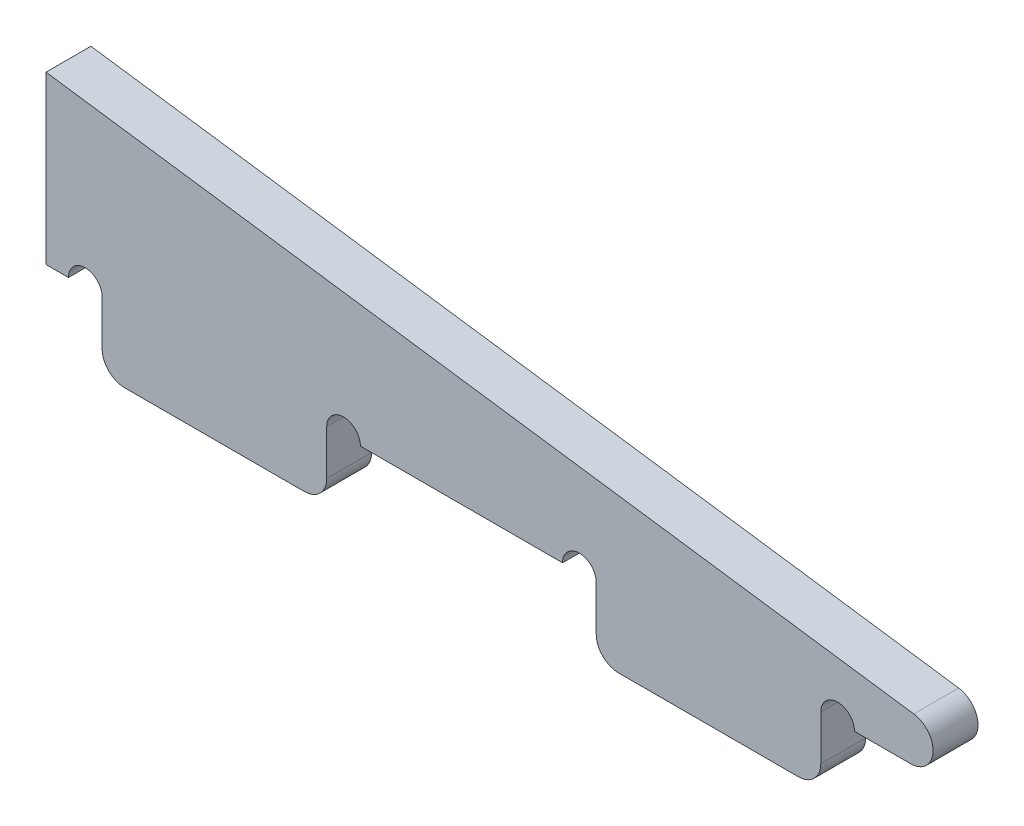
ISO-10303-21;
HEADER;
FILE_DESCRIPTION(('STEP AP214'),'2;1');
FILE_NAME('part.step','',(''),(''),'','','');
FILE_SCHEMA(('AUTOMOTIVE_DESIGN { 1 0 10303 214 1 1 1 1 }'));
ENDSEC;
DATA;
#1=APPLICATION_CONTEXT('core data for automotive mechanical design processes');
#2=APPLICATION_PROTOCOL_DEFINITION('international standard','automotive_design',2000,#1);
#3=PRODUCT_CONTEXT('',#1,'mechanical');
#4=PRODUCT('Part','Part','',(#3));
#5=PRODUCT_RELATED_PRODUCT_CATEGORY('part','',(#4));
#6=PRODUCT_DEFINITION_FORMATION('','',#4);
#7=PRODUCT_DEFINITION_CONTEXT('part definition',#1,'design');
#8=PRODUCT_DEFINITION('design','',#6,#7);
#9=PRODUCT_DEFINITION_SHAPE('','',#8);
#10=(LENGTH_UNIT() NAMED_UNIT(*) SI_UNIT(.MILLI.,.METRE.));
#11=(NAMED_UNIT(*) PLANE_ANGLE_UNIT() SI_UNIT($,.RADIAN.));
#12=(NAMED_UNIT(*) SI_UNIT($,.STERADIAN.) SOLID_ANGLE_UNIT());
#13=UNCERTAINTY_MEASURE_WITH_UNIT(LENGTH_MEASURE(1.E-05),#10,'distance_accuracy_value','');
#14=(GEOMETRIC_REPRESENTATION_CONTEXT(3) GLOBAL_UNCERTAINTY_ASSIGNED_CONTEXT((#13)) GLOBAL_UNIT_ASSIGNED_CONTEXT((#10,
#11,#12)) REPRESENTATION_CONTEXT('',''));
#15=CARTESIAN_POINT('',(0.,0.,0.));
#16=DIRECTION('',(0.,0.,1.));
#17=DIRECTION('',(1.,0.,0.));
#18=AXIS2_PLACEMENT_3D('',#15,#16,#17);
#19=CARTESIAN_POINT('',(0.,0.,2.));
#20=DIRECTION('',(0.,1.,0.));
#21=DIRECTION('',(0.,0.,1.));
#22=AXIS2_PLACEMENT_3D('',#19,#20,#21);
#23=PLANE('',#22);
#24=DIRECTION('',(1.,0.,0.));
#25=VECTOR('',#24,1.);
#26=CARTESIAN_POINT('',(0.,0.,2.));
#27=LINE('',#26,#25);
#28=CARTESIAN_POINT('',(1.5,0.,2.));
#29=VERTEX_POINT('',#28);
#30=CARTESIAN_POINT('',(4.,0.,2.));
#31=VERTEX_POINT('',#30);
#32=EDGE_CURVE('E202',#29,#31,#27,.T.);
#33=ORIENTED_EDGE('',*,*,#32,.F.);
#34=DIRECTION('',(0.,0.,1.));
#35=VECTOR('',#34,1.);
#36=CARTESIAN_POINT('',(1.5,0.,0.));
#37=LINE('',#36,#35);
#38=CARTESIAN_POINT('',(1.5,0.,0.));
#39=VERTEX_POINT('',#38);
#40=EDGE_CURVE('E187',#29,#39,#37,.F.);
#41=ORIENTED_EDGE('',*,*,#40,.T.);
#42=DIRECTION('',(1.,0.,0.));
#43=VECTOR('',#42,1.);
#44=CARTESIAN_POINT('',(0.,0.,0.));
#45=LINE('',#44,#43);
#46=CARTESIAN_POINT('',(4.,0.,0.));
#47=VERTEX_POINT('',#46);
#48=EDGE_CURVE('E200',#39,#47,#45,.T.);
#49=ORIENTED_EDGE('',*,*,#48,.T.);
#50=DIRECTION('',(0.,0.,-1.));
#51=VECTOR('',#50,1.);
#52=CARTESIAN_POINT('',(4.,0.,2.));
#53=LINE('',#52,#51);
#54=EDGE_CURVE('E265',#31,#47,#53,.T.);
#55=ORIENTED_EDGE('',*,*,#54,.F.);
#56=EDGE_LOOP('',(#33,#41,#49,#55));
#57=FACE_BOUND('',#56,.T.);
#58=ADVANCED_FACE('F44',(#57),#23,.F.);
#59=CARTESIAN_POINT('',(4.,1.,2.));
#60=DIRECTION('',(0.,0.,-1.));
#61=DIRECTION('',(-1.,0.,0.));
#62=AXIS2_PLACEMENT_3D('',#59,#60,#61);
#63=CYLINDRICAL_SURFACE('',#62,1.);
#64=CARTESIAN_POINT('',(4.,1.,0.));
#65=DIRECTION('',(0.,0.,1.));
#66=DIRECTION('',(1.,0.,0.));
#67=AXIS2_PLACEMENT_3D('',#64,#65,#66);
#68=CIRCLE('',#67,1.);
#69=CARTESIAN_POINT('',(4.13917310096006,1.99026806874157,0.));
#70=VERTEX_POINT('',#69);
#71=EDGE_CURVE('E208',#47,#70,#68,.T.);
#72=ORIENTED_EDGE('',*,*,#71,.T.);
#73=DIRECTION('',(0.,0.,-1.));
#74=VECTOR('',#73,1.);
#75=CARTESIAN_POINT('',(4.13917310096006,1.99026806874157,2.));
#76=LINE('',#75,#74);
#77=CARTESIAN_POINT('',(4.13917310096006,1.99026806874157,2.));
#78=VERTEX_POINT('',#77);
#79=EDGE_CURVE('E262',#78,#70,#76,.T.);
#80=ORIENTED_EDGE('',*,*,#79,.F.);
#81=CARTESIAN_POINT('',(4.,1.,2.));
#82=DIRECTION('',(0.,0.,1.));
#83=DIRECTION('',(1.,0.,0.));
#84=AXIS2_PLACEMENT_3D('',#81,#82,#83);
#85=CIRCLE('',#84,1.);
#86=EDGE_CURVE('E384',#31,#78,#85,.T.);
#87=ORIENTED_EDGE('',*,*,#86,.F.);
#88=ORIENTED_EDGE('',*,*,#54,.T.);
#89=EDGE_LOOP('',(#72,#80,#87,#88));
#90=FACE_BOUND('',#89,.T.);
#91=ADVANCED_FACE('F422',(#90),#63,.T.);
#92=CARTESIAN_POINT('',(4.13917310096006,1.99026806874157,2.));
#93=DIRECTION('',(-0.139173100960058,-0.990268068741571,0.));
#94=DIRECTION('',(0.990268068741571,-0.139173100960058,0.));
#95=AXIS2_PLACEMENT_3D('',#92,#93,#94);
#96=PLANE('',#95);
#97=DIRECTION('',(-0.990268068741571,0.139173100960058,0.));
#98=VECTOR('',#97,1.);
#99=CARTESIAN_POINT('',(4.13917310096006,1.99026806874157,0.));
#100=LINE('',#99,#98);
#101=CARTESIAN_POINT('',(-34.5,7.42064970856041,0.));
#102=VERTEX_POINT('',#101);
#103=EDGE_CURVE('E212',#70,#102,#100,.T.);
#104=ORIENTED_EDGE('',*,*,#103,.T.);
#105=DIRECTION('',(0.,0.,-1.));
#106=VECTOR('',#105,1.);
#107=CARTESIAN_POINT('',(-34.5,7.42064970856041,2.));
#108=LINE('',#107,#106);
#109=CARTESIAN_POINT('',(-34.5,7.42064970856041,2.));
#110=VERTEX_POINT('',#109);
#111=EDGE_CURVE('E259',#110,#102,#108,.T.);
#112=ORIENTED_EDGE('',*,*,#111,.F.);
#113=DIRECTION('',(-0.990268068741571,0.139173100960058,0.));
#114=VECTOR('',#113,1.);
#115=CARTESIAN_POINT('',(4.13917310096006,1.99026806874157,2.));
#116=LINE('',#115,#114);
#117=EDGE_CURVE('E393',#78,#110,#116,.T.);
#118=ORIENTED_EDGE('',*,*,#117,.F.);
#119=ORIENTED_EDGE('',*,*,#79,.T.);
#120=EDGE_LOOP('',(#104,#112,#118,#119));
#121=FACE_BOUND('',#120,.T.);
#122=ADVANCED_FACE('F417',(#121),#96,.F.);
#123=CARTESIAN_POINT('',(-34.5,7.42064970856041,2.));
#124=DIRECTION('',(1.,0.,0.));
#125=DIRECTION('',(0.,0.,-1.));
#126=AXIS2_PLACEMENT_3D('',#123,#124,#125);
#127=PLANE('',#126);
#128=DIRECTION('',(0.,-1.,0.));
#129=VECTOR('',#128,1.);
#130=CARTESIAN_POINT('',(-34.5,7.42064970856041,0.));
#131=LINE('',#130,#129);
#132=CARTESIAN_POINT('',(-34.5,0.,0.));
#133=VERTEX_POINT('',#132);
#134=EDGE_CURVE('E223',#102,#133,#131,.T.);
#135=ORIENTED_EDGE('',*,*,#134,.T.);
#136=DIRECTION('',(0.,0.,-1.));
#137=VECTOR('',#136,1.);
#138=CARTESIAN_POINT('',(-34.5,0.,2.));
#139=LINE('',#138,#137);
#140=CARTESIAN_POINT('',(-34.5,0.,2.));
#141=VERTEX_POINT('',#140);
#142=EDGE_CURVE('E256',#141,#133,#139,.T.);
#143=ORIENTED_EDGE('',*,*,#142,.F.);
#144=DIRECTION('',(0.,-1.,0.));
#145=VECTOR('',#144,1.);
#146=CARTESIAN_POINT('',(-34.5,7.42064970856041,2.));
#147=LINE('',#146,#145);
#148=EDGE_CURVE('E395',#110,#141,#147,.T.);
#149=ORIENTED_EDGE('',*,*,#148,.F.);
#150=ORIENTED_EDGE('',*,*,#111,.T.);
#151=EDGE_LOOP('',(#135,#143,#149,#150));
#152=FACE_BOUND('',#151,.T.);
#153=ADVANCED_FACE('F414',(#152),#127,.F.);
#154=CARTESIAN_POINT('',(-34.5,0.,2.));
#155=DIRECTION('',(0.,1.,0.));
#156=DIRECTION('',(0.,0.,1.));
#157=AXIS2_PLACEMENT_3D('',#154,#155,#156);
#158=PLANE('',#157);
#159=DIRECTION('',(1.,0.,0.));
#160=VECTOR('',#159,1.);
#161=CARTESIAN_POINT('',(-34.5,0.,0.));
#162=LINE('',#161,#160);
#163=CARTESIAN_POINT('',(-33.5,0.,0.));
#164=VERTEX_POINT('',#163);
#165=EDGE_CURVE('E225',#133,#164,#162,.T.);
#166=ORIENTED_EDGE('',*,*,#165,.T.);
#167=DIRECTION('',(0.,0.,1.));
#168=VECTOR('',#167,1.);
#169=CARTESIAN_POINT('',(-33.5,0.,0.));
#170=LINE('',#169,#168);
#171=CARTESIAN_POINT('',(-33.5,0.,2.));
#172=VERTEX_POINT('',#171);
#173=EDGE_CURVE('E210',#164,#172,#170,.T.);
#174=ORIENTED_EDGE('',*,*,#173,.T.);
#175=DIRECTION('',(1.,0.,0.));
#176=VECTOR('',#175,1.);
#177=CARTESIAN_POINT('',(-34.5,0.,2.));
#178=LINE('',#177,#176);
#179=EDGE_CURVE('E397',#141,#172,#178,.T.);
#180=ORIENTED_EDGE('',*,*,#179,.F.);
#181=ORIENTED_EDGE('',*,*,#142,.T.);
#182=EDGE_LOOP('',(#166,#174,#180,#181));
#183=FACE_BOUND('',#182,.T.);
#184=ADVANCED_FACE('F409',(#183),#158,.F.);
#185=CARTESIAN_POINT('',(-32.,0.,2.));
#186=DIRECTION('',(1.,0.,0.));
#187=DIRECTION('',(0.,0.,-1.));
#188=AXIS2_PLACEMENT_3D('',#185,#186,#187);
#189=PLANE('',#188);
#190=DIRECTION('',(0.,-1.,0.));
#191=VECTOR('',#190,1.);
#192=CARTESIAN_POINT('',(-32.,0.,0.));
#193=LINE('',#192,#191);
#194=CARTESIAN_POINT('',(-32.,0.,0.));
#195=VERTEX_POINT('',#194);
#196=CARTESIAN_POINT('',(-32.,-2.,0.));
#197=VERTEX_POINT('',#196);
#198=EDGE_CURVE('E228',#195,#197,#193,.T.);
#199=ORIENTED_EDGE('',*,*,#198,.T.);
#200=DIRECTION('',(0.,0.,-1.));
#201=VECTOR('',#200,1.);
#202=CARTESIAN_POINT('',(-32.,-2.,2.));
#203=LINE('',#202,#201);
#204=CARTESIAN_POINT('',(-32.,-2.,2.));
#205=VERTEX_POINT('',#204);
#206=EDGE_CURVE('E12',#197,#205,#203,.F.);
#207=ORIENTED_EDGE('',*,*,#206,.T.);
#208=DIRECTION('',(0.,-1.,0.));
#209=VECTOR('',#208,1.);
#210=CARTESIAN_POINT('',(-32.,0.,2.));
#211=LINE('',#210,#209);
#212=CARTESIAN_POINT('',(-32.,0.,2.));
#213=VERTEX_POINT('',#212);
#214=EDGE_CURVE('E299',#213,#205,#211,.T.);
#215=ORIENTED_EDGE('',*,*,#214,.F.);
#216=DIRECTION('',(0.,0.,-1.));
#217=VECTOR('',#216,1.);
#218=CARTESIAN_POINT('',(-32.,0.,2.));
#219=LINE('',#218,#217);
#220=EDGE_CURVE('E253',#213,#195,#219,.T.);
#221=ORIENTED_EDGE('',*,*,#220,.T.);
#222=EDGE_LOOP('',(#199,#207,#215,#221));
#223=FACE_BOUND('',#222,.T.);
#224=ADVANCED_FACE('F454',(#223),#189,.F.);
#225=CARTESIAN_POINT('',(-32.,-3.,2.));
#226=DIRECTION('',(0.,1.,0.));
#227=DIRECTION('',(0.,0.,1.));
#228=AXIS2_PLACEMENT_3D('',#225,#226,#227);
#229=PLANE('',#228);
#230=DIRECTION('',(1.,0.,0.));
#231=VECTOR('',#230,1.);
#232=CARTESIAN_POINT('',(-32.,-3.,0.));
#233=LINE('',#232,#231);
#234=CARTESIAN_POINT('',(-31.,-3.,0.));
#235=VERTEX_POINT('',#234);
#236=CARTESIAN_POINT('',(-23.,-3.,0.));
#237=VERTEX_POINT('',#236);
#238=EDGE_CURVE('E231',#235,#237,#233,.T.);
#239=ORIENTED_EDGE('',*,*,#238,.T.);
#240=DIRECTION('',(0.,0.,-1.));
#241=VECTOR('',#240,1.);
#242=CARTESIAN_POINT('',(-23.,-3.,2.));
#243=LINE('',#242,#241);
#244=CARTESIAN_POINT('',(-23.,-3.,2.));
#245=VERTEX_POINT('',#244);
#246=EDGE_CURVE('E52',#237,#245,#243,.F.);
#247=ORIENTED_EDGE('',*,*,#246,.T.);
#248=DIRECTION('',(1.,0.,0.));
#249=VECTOR('',#248,1.);
#250=CARTESIAN_POINT('',(-32.,-3.,2.));
#251=LINE('',#250,#249);
#252=CARTESIAN_POINT('',(-31.,-3.,2.));
#253=VERTEX_POINT('',#252);
#254=EDGE_CURVE('E295',#253,#245,#251,.T.);
#255=ORIENTED_EDGE('',*,*,#254,.F.);
#256=DIRECTION('',(0.,0.,-1.));
#257=VECTOR('',#256,1.);
#258=CARTESIAN_POINT('',(-31.,-3.,2.));
#259=LINE('',#258,#257);
#260=EDGE_CURVE('E342',#253,#235,#259,.T.);
#261=ORIENTED_EDGE('',*,*,#260,.T.);
#262=EDGE_LOOP('',(#239,#247,#255,#261));
#263=FACE_BOUND('',#262,.T.);
#264=ADVANCED_FACE('F347',(#263),#229,.F.);
#265=CARTESIAN_POINT('',(-22.,-3.,2.));
#266=DIRECTION('',(-1.,0.,0.));
#267=DIRECTION('',(0.,0.,1.));
#268=AXIS2_PLACEMENT_3D('',#265,#266,#267);
#269=PLANE('',#268);
#270=DIRECTION('',(0.,1.,0.));
#271=VECTOR('',#270,1.);
#272=CARTESIAN_POINT('',(-22.,-3.,2.));
#273=LINE('',#272,#271);
#274=CARTESIAN_POINT('',(-22.,-2.,2.));
#275=VERTEX_POINT('',#274);
#276=CARTESIAN_POINT('',(-22.,0.,2.));
#277=VERTEX_POINT('',#276);
#278=EDGE_CURVE('E298',#275,#277,#273,.T.);
#279=ORIENTED_EDGE('',*,*,#278,.F.);
#280=DIRECTION('',(0.,0.,-1.));
#281=VECTOR('',#280,1.);
#282=CARTESIAN_POINT('',(-22.,-2.,2.));
#283=LINE('',#282,#281);
#284=CARTESIAN_POINT('',(-22.,-2.,0.));
#285=VERTEX_POINT('',#284);
#286=EDGE_CURVE('E339',#275,#285,#283,.T.);
#287=ORIENTED_EDGE('',*,*,#286,.T.);
#288=DIRECTION('',(0.,1.,0.));
#289=VECTOR('',#288,1.);
#290=CARTESIAN_POINT('',(-22.,-3.,0.));
#291=LINE('',#290,#289);
#292=CARTESIAN_POINT('',(-22.,0.,0.));
#293=VERTEX_POINT('',#292);
#294=EDGE_CURVE('E234',#285,#293,#291,.T.);
#295=ORIENTED_EDGE('',*,*,#294,.T.);
#296=DIRECTION('',(0.,0.,-1.));
#297=VECTOR('',#296,1.);
#298=CARTESIAN_POINT('',(-22.,0.,2.));
#299=LINE('',#298,#297);
#300=EDGE_CURVE('E250',#277,#293,#299,.T.);
#301=ORIENTED_EDGE('',*,*,#300,.F.);
#302=EDGE_LOOP('',(#279,#287,#295,#301));
#303=FACE_BOUND('',#302,.T.);
#304=ADVANCED_FACE('F460',(#303),#269,.F.);
#305=CARTESIAN_POINT('',(-22.,0.,2.));
#306=DIRECTION('',(0.,1.,0.));
#307=DIRECTION('',(0.,0.,1.));
#308=AXIS2_PLACEMENT_3D('',#305,#306,#307);
#309=PLANE('',#308);
#310=DIRECTION('',(1.,0.,0.));
#311=VECTOR('',#310,1.);
#312=CARTESIAN_POINT('',(-22.,0.,2.));
#313=LINE('',#312,#311);
#314=CARTESIAN_POINT('',(-20.5,0.,2.));
#315=VERTEX_POINT('',#314);
#316=CARTESIAN_POINT('',(-11.5,0.,2.));
#317=VERTEX_POINT('',#316);
#318=EDGE_CURVE('E304',#315,#317,#313,.T.);
#319=ORIENTED_EDGE('',*,*,#318,.F.);
#320=DIRECTION('',(0.,0.,1.));
#321=VECTOR('',#320,1.);
#322=CARTESIAN_POINT('',(-20.5,0.,0.));
#323=LINE('',#322,#321);
#324=CARTESIAN_POINT('',(-20.5,0.,0.));
#325=VERTEX_POINT('',#324);
#326=EDGE_CURVE('E215',#315,#325,#323,.F.);
#327=ORIENTED_EDGE('',*,*,#326,.T.);
#328=DIRECTION('',(1.,0.,0.));
#329=VECTOR('',#328,1.);
#330=CARTESIAN_POINT('',(-22.,0.,0.));
#331=LINE('',#330,#329);
#332=CARTESIAN_POINT('',(-11.5,0.,0.));
#333=VERTEX_POINT('',#332);
#334=EDGE_CURVE('E236',#325,#333,#331,.T.);
#335=ORIENTED_EDGE('',*,*,#334,.T.);
#336=DIRECTION('',(0.,0.,1.));
#337=VECTOR('',#336,1.);
#338=CARTESIAN_POINT('',(-11.5,0.,0.));
#339=LINE('',#338,#337);
#340=EDGE_CURVE('E203',#333,#317,#339,.T.);
#341=ORIENTED_EDGE('',*,*,#340,.T.);
#342=EDGE_LOOP('',(#319,#327,#335,#341));
#343=FACE_BOUND('',#342,.T.);
#344=ADVANCED_FACE('F377',(#343),#309,.F.);
#345=CARTESIAN_POINT('',(-10.,0.,2.));
#346=DIRECTION('',(1.,0.,0.));
#347=DIRECTION('',(0.,0.,-1.));
#348=AXIS2_PLACEMENT_3D('',#345,#346,#347);
#349=PLANE('',#348);
#350=DIRECTION('',(0.,-1.,0.));
#351=VECTOR('',#350,1.);
#352=CARTESIAN_POINT('',(-10.,0.,0.));
#353=LINE('',#352,#351);
#354=CARTESIAN_POINT('',(-10.,0.,0.));
#355=VERTEX_POINT('',#354);
#356=CARTESIAN_POINT('',(-10.,-2.,0.));
#357=VERTEX_POINT('',#356);
#358=EDGE_CURVE('E239',#355,#357,#353,.T.);
#359=ORIENTED_EDGE('',*,*,#358,.T.);
#360=DIRECTION('',(0.,0.,-1.));
#361=VECTOR('',#360,1.);
#362=CARTESIAN_POINT('',(-10.,-2.,2.));
#363=LINE('',#362,#361);
#364=CARTESIAN_POINT('',(-10.,-2.,2.));
#365=VERTEX_POINT('',#364);
#366=EDGE_CURVE('E59',#357,#365,#363,.F.);
#367=ORIENTED_EDGE('',*,*,#366,.T.);
#368=DIRECTION('',(0.,-1.,0.));
#369=VECTOR('',#368,1.);
#370=CARTESIAN_POINT('',(-10.,0.,2.));
#371=LINE('',#370,#369);
#372=CARTESIAN_POINT('',(-10.,0.,2.));
#373=VERTEX_POINT('',#372);
#374=EDGE_CURVE('E323',#373,#365,#371,.T.);
#375=ORIENTED_EDGE('',*,*,#374,.F.);
#376=DIRECTION('',(0.,0.,-1.));
#377=VECTOR('',#376,1.);
#378=CARTESIAN_POINT('',(-10.,0.,2.));
#379=LINE('',#378,#377);
#380=EDGE_CURVE('E247',#373,#355,#379,.T.);
#381=ORIENTED_EDGE('',*,*,#380,.T.);
#382=EDGE_LOOP('',(#359,#367,#375,#381));
#383=FACE_BOUND('',#382,.T.);
#384=ADVANCED_FACE('F368',(#383),#349,.F.);
#385=CARTESIAN_POINT('',(-10.,-3.,2.));
#386=DIRECTION('',(0.,1.,0.));
#387=DIRECTION('',(0.,0.,1.));
#388=AXIS2_PLACEMENT_3D('',#385,#386,#387);
#389=PLANE('',#388);
#390=DIRECTION('',(1.,0.,0.));
#391=VECTOR('',#390,1.);
#392=CARTESIAN_POINT('',(-10.,-3.,0.));
#393=LINE('',#392,#391);
#394=CARTESIAN_POINT('',(-9.,-3.,0.));
#395=VERTEX_POINT('',#394);
#396=CARTESIAN_POINT('',(-0.999999999999999,-3.,0.));
#397=VERTEX_POINT('',#396);
#398=EDGE_CURVE('E241',#395,#397,#393,.T.);
#399=ORIENTED_EDGE('',*,*,#398,.T.);
#400=DIRECTION('',(0.,0.,-1.));
#401=VECTOR('',#400,1.);
#402=CARTESIAN_POINT('',(-0.999999999999999,-3.,2.));
#403=LINE('',#402,#401);
#404=CARTESIAN_POINT('',(-0.999999999999999,-3.,2.));
#405=VERTEX_POINT('',#404);
#406=EDGE_CURVE('E281',#397,#405,#403,.F.);
#407=ORIENTED_EDGE('',*,*,#406,.T.);
#408=DIRECTION('',(1.,0.,0.));
#409=VECTOR('',#408,1.);
#410=CARTESIAN_POINT('',(-10.,-3.,2.));
#411=LINE('',#410,#409);
#412=CARTESIAN_POINT('',(-9.,-3.,2.));
#413=VERTEX_POINT('',#412);
#414=EDGE_CURVE('E325',#413,#405,#411,.T.);
#415=ORIENTED_EDGE('',*,*,#414,.F.);
#416=DIRECTION('',(0.,0.,-1.));
#417=VECTOR('',#416,1.);
#418=CARTESIAN_POINT('',(-9.,-3.,2.));
#419=LINE('',#418,#417);
#420=EDGE_CURVE('E278',#413,#395,#419,.T.);
#421=ORIENTED_EDGE('',*,*,#420,.T.);
#422=EDGE_LOOP('',(#399,#407,#415,#421));
#423=FACE_BOUND('',#422,.T.);
#424=ADVANCED_FACE('F363',(#423),#389,.F.);
#425=CARTESIAN_POINT('',(0.,-3.,2.));
#426=DIRECTION('',(-1.,0.,0.));
#427=DIRECTION('',(0.,0.,1.));
#428=AXIS2_PLACEMENT_3D('',#425,#426,#427);
#429=PLANE('',#428);
#430=DIRECTION('',(0.,1.,0.));
#431=VECTOR('',#430,1.);
#432=CARTESIAN_POINT('',(0.,-3.,2.));
#433=LINE('',#432,#431);
#434=CARTESIAN_POINT('',(0.,-2.,2.));
#435=VERTEX_POINT('',#434);
#436=CARTESIAN_POINT('',(0.,0.,2.));
#437=VERTEX_POINT('',#436);
#438=EDGE_CURVE('E218',#435,#437,#433,.T.);
#439=ORIENTED_EDGE('',*,*,#438,.F.);
#440=DIRECTION('',(0.,0.,-1.));
#441=VECTOR('',#440,1.);
#442=CARTESIAN_POINT('',(0.,-2.,2.));
#443=LINE('',#442,#441);
#444=CARTESIAN_POINT('',(0.,-2.,0.));
#445=VERTEX_POINT('',#444);
#446=EDGE_CURVE('E267',#435,#445,#443,.T.);
#447=ORIENTED_EDGE('',*,*,#446,.T.);
#448=DIRECTION('',(0.,1.,0.));
#449=VECTOR('',#448,1.);
#450=CARTESIAN_POINT('',(0.,-3.,0.));
#451=LINE('',#450,#449);
#452=CARTESIAN_POINT('',(0.,0.,0.));
#453=VERTEX_POINT('',#452);
#454=EDGE_CURVE('E244',#445,#453,#451,.T.);
#455=ORIENTED_EDGE('',*,*,#454,.T.);
#456=DIRECTION('',(0.,0.,-1.));
#457=VECTOR('',#456,1.);
#458=CARTESIAN_POINT('',(0.,0.,2.));
#459=LINE('',#458,#457);
#460=EDGE_CURVE('E190',#437,#453,#459,.T.);
#461=ORIENTED_EDGE('',*,*,#460,.F.);
#462=EDGE_LOOP('',(#439,#447,#455,#461));
#463=FACE_BOUND('',#462,.T.);
#464=ADVANCED_FACE('F426',(#463),#429,.F.);
#465=CARTESIAN_POINT('',(4.,1.,2.));
#466=DIRECTION('',(0.,0.,1.));
#467=DIRECTION('',(1.,0.,0.));
#468=AXIS2_PLACEMENT_3D('',#465,#466,#467);
#469=PLANE('',#468);
#470=ORIENTED_EDGE('',*,*,#414,.T.);
#471=CARTESIAN_POINT('',(-1.,-2.,2.));
#472=DIRECTION('',(0.,0.,1.));
#473=DIRECTION('',(1.,0.,0.));
#474=AXIS2_PLACEMENT_3D('',#471,#472,#473);
#475=CIRCLE('',#474,1.);
#476=EDGE_CURVE('E333',#405,#435,#475,.T.);
#477=ORIENTED_EDGE('',*,*,#476,.T.);
#478=ORIENTED_EDGE('',*,*,#438,.T.);
#479=CARTESIAN_POINT('',(0.75,0.,2.));
#480=DIRECTION('',(0.,0.,1.));
#481=DIRECTION('',(1.,0.,0.));
#482=AXIS2_PLACEMENT_3D('',#479,#480,#481);
#483=CIRCLE('',#482,0.75);
#484=EDGE_CURVE('E195',#29,#437,#483,.T.);
#485=ORIENTED_EDGE('',*,*,#484,.F.);
#486=ORIENTED_EDGE('',*,*,#32,.T.);
#487=ORIENTED_EDGE('',*,*,#86,.T.);
#488=ORIENTED_EDGE('',*,*,#117,.T.);
#489=ORIENTED_EDGE('',*,*,#148,.T.);
#490=ORIENTED_EDGE('',*,*,#179,.T.);
#491=CARTESIAN_POINT('',(-32.75,0.,2.));
#492=DIRECTION('',(0.,0.,1.));
#493=DIRECTION('',(1.,0.,0.));
#494=AXIS2_PLACEMENT_3D('',#491,#492,#493);
#495=CIRCLE('',#494,0.749999999999999);
#496=EDGE_CURVE('E400',#213,#172,#495,.T.);
#497=ORIENTED_EDGE('',*,*,#496,.F.);
#498=ORIENTED_EDGE('',*,*,#214,.T.);
#499=CARTESIAN_POINT('',(-31.,-2.,2.));
#500=DIRECTION('',(0.,0.,1.));
#501=DIRECTION('',(1.,0.,0.));
#502=AXIS2_PLACEMENT_3D('',#499,#500,#501);
#503=CIRCLE('',#502,1.);
#504=EDGE_CURVE('E283',#205,#253,#503,.T.);
#505=ORIENTED_EDGE('',*,*,#504,.T.);
#506=ORIENTED_EDGE('',*,*,#254,.T.);
#507=CARTESIAN_POINT('',(-23.,-2.,2.));
#508=DIRECTION('',(0.,0.,1.));
#509=DIRECTION('',(1.,0.,0.));
#510=AXIS2_PLACEMENT_3D('',#507,#508,#509);
#511=CIRCLE('',#510,1.);
#512=EDGE_CURVE('E67',#245,#275,#511,.T.);
#513=ORIENTED_EDGE('',*,*,#512,.T.);
#514=ORIENTED_EDGE('',*,*,#278,.T.);
#515=CARTESIAN_POINT('',(-21.25,0.,2.));
#516=DIRECTION('',(0.,0.,1.));
#517=DIRECTION('',(1.,0.,0.));
#518=AXIS2_PLACEMENT_3D('',#515,#516,#517);
#519=CIRCLE('',#518,0.750000000000002);
#520=EDGE_CURVE('E311',#315,#277,#519,.T.);
#521=ORIENTED_EDGE('',*,*,#520,.F.);
#522=ORIENTED_EDGE('',*,*,#318,.T.);
#523=CARTESIAN_POINT('',(-10.75,0.,2.));
#524=DIRECTION('',(0.,0.,1.));
#525=DIRECTION('',(1.,0.,0.));
#526=AXIS2_PLACEMENT_3D('',#523,#524,#525);
#527=CIRCLE('',#526,0.75);
#528=EDGE_CURVE('E194',#373,#317,#527,.T.);
#529=ORIENTED_EDGE('',*,*,#528,.F.);
#530=ORIENTED_EDGE('',*,*,#374,.T.);
#531=CARTESIAN_POINT('',(-9.,-2.,2.));
#532=DIRECTION('',(0.,0.,1.));
#533=DIRECTION('',(1.,0.,0.));
#534=AXIS2_PLACEMENT_3D('',#531,#532,#533);
#535=CIRCLE('',#534,1.);
#536=EDGE_CURVE('E336',#365,#413,#535,.T.);
#537=ORIENTED_EDGE('',*,*,#536,.T.);
#538=EDGE_LOOP('',(#470,#477,#478,#485,#486,#487,#488,#489,#490,#497,#498,#505,#506,#513,#514,
#521,#522,#529,#530,#537));
#539=FACE_BOUND('',#538,.T.);
#540=ADVANCED_FACE('F351',(#539),#469,.T.);
#541=CARTESIAN_POINT('',(4.,1.,0.));
#542=DIRECTION('',(0.,0.,1.));
#543=DIRECTION('',(1.,0.,0.));
#544=AXIS2_PLACEMENT_3D('',#541,#542,#543);
#545=PLANE('',#544);
#546=ORIENTED_EDGE('',*,*,#454,.F.);
#547=CARTESIAN_POINT('',(-1.,-2.,0.));
#548=DIRECTION('',(0.,0.,1.));
#549=DIRECTION('',(1.,0.,0.));
#550=AXIS2_PLACEMENT_3D('',#547,#548,#549);
#551=CIRCLE('',#550,1.);
#552=EDGE_CURVE('E276',#445,#397,#551,.F.);
#553=ORIENTED_EDGE('',*,*,#552,.T.);
#554=ORIENTED_EDGE('',*,*,#398,.F.);
#555=CARTESIAN_POINT('',(-9.,-2.,0.));
#556=DIRECTION('',(0.,0.,1.));
#557=DIRECTION('',(1.,0.,0.));
#558=AXIS2_PLACEMENT_3D('',#555,#556,#557);
#559=CIRCLE('',#558,1.);
#560=EDGE_CURVE('E274',#395,#357,#559,.F.);
#561=ORIENTED_EDGE('',*,*,#560,.T.);
#562=ORIENTED_EDGE('',*,*,#358,.F.);
#563=CARTESIAN_POINT('',(-10.75,0.,0.));
#564=DIRECTION('',(0.,0.,1.));
#565=DIRECTION('',(1.,0.,0.));
#566=AXIS2_PLACEMENT_3D('',#563,#564,#565);
#567=CIRCLE('',#566,0.75);
#568=EDGE_CURVE('E317',#355,#333,#567,.T.);
#569=ORIENTED_EDGE('',*,*,#568,.T.);
#570=ORIENTED_EDGE('',*,*,#334,.F.);
#571=CARTESIAN_POINT('',(-21.25,0.,0.));
#572=DIRECTION('',(0.,0.,1.));
#573=DIRECTION('',(1.,0.,0.));
#574=AXIS2_PLACEMENT_3D('',#571,#572,#573);
#575=CIRCLE('',#574,0.750000000000002);
#576=EDGE_CURVE('E316',#325,#293,#575,.T.);
#577=ORIENTED_EDGE('',*,*,#576,.T.);
#578=ORIENTED_EDGE('',*,*,#294,.F.);
#579=CARTESIAN_POINT('',(-23.,-2.,0.));
#580=DIRECTION('',(0.,0.,1.));
#581=DIRECTION('',(1.,0.,0.));
#582=AXIS2_PLACEMENT_3D('',#579,#580,#581);
#583=CIRCLE('',#582,1.);
#584=EDGE_CURVE('E272',#285,#237,#583,.F.);
#585=ORIENTED_EDGE('',*,*,#584,.T.);
#586=ORIENTED_EDGE('',*,*,#238,.F.);
#587=CARTESIAN_POINT('',(-31.,-2.,0.));
#588=DIRECTION('',(0.,0.,1.));
#589=DIRECTION('',(1.,0.,0.));
#590=AXIS2_PLACEMENT_3D('',#587,#588,#589);
#591=CIRCLE('',#590,1.);
#592=EDGE_CURVE('E270',#235,#197,#591,.F.);
#593=ORIENTED_EDGE('',*,*,#592,.T.);
#594=ORIENTED_EDGE('',*,*,#198,.F.);
#595=CARTESIAN_POINT('',(-32.75,0.,0.));
#596=DIRECTION('',(0.,0.,1.));
#597=DIRECTION('',(1.,0.,0.));
#598=AXIS2_PLACEMENT_3D('',#595,#596,#597);
#599=CIRCLE('',#598,0.749999999999999);
#600=EDGE_CURVE('E204',#195,#164,#599,.T.);
#601=ORIENTED_EDGE('',*,*,#600,.T.);
#602=ORIENTED_EDGE('',*,*,#165,.F.);
#603=ORIENTED_EDGE('',*,*,#134,.F.);
#604=ORIENTED_EDGE('',*,*,#103,.F.);
#605=ORIENTED_EDGE('',*,*,#71,.F.);
#606=ORIENTED_EDGE('',*,*,#48,.F.);
#607=CARTESIAN_POINT('',(0.75,0.,0.));
#608=DIRECTION('',(0.,0.,1.));
#609=DIRECTION('',(1.,0.,0.));
#610=AXIS2_PLACEMENT_3D('',#607,#608,#609);
#611=CIRCLE('',#610,0.75);
#612=EDGE_CURVE('E183',#39,#453,#611,.T.);
#613=ORIENTED_EDGE('',*,*,#612,.T.);
#614=EDGE_LOOP('',(#546,#553,#554,#561,#562,#569,#570,#577,#578,#585,#586,#593,#594,#601,#602,
#603,#604,#605,#606,#613));
#615=FACE_BOUND('',#614,.T.);
#616=ADVANCED_FACE('F206',(#615),#545,.F.);
#617=CARTESIAN_POINT('',(0.75,0.,0.));
#618=DIRECTION('',(0.,0.,1.));
#619=DIRECTION('',(1.,0.,0.));
#620=AXIS2_PLACEMENT_3D('',#617,#618,#619);
#621=CYLINDRICAL_SURFACE('',#620,0.75);
#622=ORIENTED_EDGE('',*,*,#484,.T.);
#623=ORIENTED_EDGE('',*,*,#460,.T.);
#624=ORIENTED_EDGE('',*,*,#612,.F.);
#625=ORIENTED_EDGE('',*,*,#40,.F.);
#626=EDGE_LOOP('',(#622,#623,#624,#625));
#627=FACE_BOUND('',#626,.T.);
#628=ADVANCED_FACE('F186',(#627),#621,.F.);
#629=CARTESIAN_POINT('',(-10.75,0.,0.));
#630=DIRECTION('',(0.,0.,1.));
#631=DIRECTION('',(1.,0.,0.));
#632=AXIS2_PLACEMENT_3D('',#629,#630,#631);
#633=CYLINDRICAL_SURFACE('',#632,0.75);
#634=ORIENTED_EDGE('',*,*,#568,.F.);
#635=ORIENTED_EDGE('',*,*,#380,.F.);
#636=ORIENTED_EDGE('',*,*,#528,.T.);
#637=ORIENTED_EDGE('',*,*,#340,.F.);
#638=EDGE_LOOP('',(#634,#635,#636,#637));
#639=FACE_BOUND('',#638,.T.);
#640=ADVANCED_FACE('F370',(#639),#633,.F.);
#641=CARTESIAN_POINT('',(-21.25,0.,0.));
#642=DIRECTION('',(0.,0.,1.));
#643=DIRECTION('',(1.,0.,0.));
#644=AXIS2_PLACEMENT_3D('',#641,#642,#643);
#645=CYLINDRICAL_SURFACE('',#644,0.750000000000002);
#646=ORIENTED_EDGE('',*,*,#576,.F.);
#647=ORIENTED_EDGE('',*,*,#326,.F.);
#648=ORIENTED_EDGE('',*,*,#520,.T.);
#649=ORIENTED_EDGE('',*,*,#300,.T.);
#650=EDGE_LOOP('',(#646,#647,#648,#649));
#651=FACE_BOUND('',#650,.T.);
#652=ADVANCED_FACE('F439',(#651),#645,.F.);
#653=CARTESIAN_POINT('',(-32.75,0.,0.));
#654=DIRECTION('',(0.,0.,1.));
#655=DIRECTION('',(1.,0.,0.));
#656=AXIS2_PLACEMENT_3D('',#653,#654,#655);
#657=CYLINDRICAL_SURFACE('',#656,0.749999999999999);
#658=ORIENTED_EDGE('',*,*,#600,.F.);
#659=ORIENTED_EDGE('',*,*,#220,.F.);
#660=ORIENTED_EDGE('',*,*,#496,.T.);
#661=ORIENTED_EDGE('',*,*,#173,.F.);
#662=EDGE_LOOP('',(#658,#659,#660,#661));
#663=FACE_BOUND('',#662,.T.);
#664=ADVANCED_FACE('F431',(#663),#657,.F.);
#665=CARTESIAN_POINT('',(-1.,-2.,2.));
#666=DIRECTION('',(0.,0.,-1.));
#667=DIRECTION('',(-1.,0.,0.));
#668=AXIS2_PLACEMENT_3D('',#665,#666,#667);
#669=CYLINDRICAL_SURFACE('',#668,1.);
#670=ORIENTED_EDGE('',*,*,#476,.F.);
#671=ORIENTED_EDGE('',*,*,#406,.F.);
#672=ORIENTED_EDGE('',*,*,#552,.F.);
#673=ORIENTED_EDGE('',*,*,#446,.F.);
#674=EDGE_LOOP('',(#670,#671,#672,#673));
#675=FACE_BOUND('',#674,.T.);
#676=ADVANCED_FACE('F429',(#675),#669,.T.);
#677=CARTESIAN_POINT('',(-9.,-2.,2.));
#678=DIRECTION('',(0.,0.,-1.));
#679=DIRECTION('',(-1.,0.,0.));
#680=AXIS2_PLACEMENT_3D('',#677,#678,#679);
#681=CYLINDRICAL_SURFACE('',#680,1.);
#682=ORIENTED_EDGE('',*,*,#536,.F.);
#683=ORIENTED_EDGE('',*,*,#366,.F.);
#684=ORIENTED_EDGE('',*,*,#560,.F.);
#685=ORIENTED_EDGE('',*,*,#420,.F.);
#686=EDGE_LOOP('',(#682,#683,#684,#685));
#687=FACE_BOUND('',#686,.T.);
#688=ADVANCED_FACE('F366',(#687),#681,.T.);
#689=CARTESIAN_POINT('',(-23.,-2.,2.));
#690=DIRECTION('',(0.,0.,-1.));
#691=DIRECTION('',(-1.,0.,0.));
#692=AXIS2_PLACEMENT_3D('',#689,#690,#691);
#693=CYLINDRICAL_SURFACE('',#692,1.);
#694=ORIENTED_EDGE('',*,*,#512,.F.);
#695=ORIENTED_EDGE('',*,*,#246,.F.);
#696=ORIENTED_EDGE('',*,*,#584,.F.);
#697=ORIENTED_EDGE('',*,*,#286,.F.);
#698=EDGE_LOOP('',(#694,#695,#696,#697));
#699=FACE_BOUND('',#698,.T.);
#700=ADVANCED_FACE('F355',(#699),#693,.T.);
#701=CARTESIAN_POINT('',(-31.,-2.,2.));
#702=DIRECTION('',(0.,0.,-1.));
#703=DIRECTION('',(-1.,0.,0.));
#704=AXIS2_PLACEMENT_3D('',#701,#702,#703);
#705=CYLINDRICAL_SURFACE('',#704,1.);
#706=ORIENTED_EDGE('',*,*,#504,.F.);
#707=ORIENTED_EDGE('',*,*,#206,.F.);
#708=ORIENTED_EDGE('',*,*,#592,.F.);
#709=ORIENTED_EDGE('',*,*,#260,.F.);
#710=EDGE_LOOP('',(#706,#707,#708,#709));
#711=FACE_BOUND('',#710,.T.);
#712=ADVANCED_FACE('F46',(#711),#705,.T.);
#713=CLOSED_SHELL('',(#58,#91,#122,#153,#184,#224,#264,#304,#344,#384,#424,#464,#540,#616,#628,
#640,#652,#664,#676,#688,#700,#712));
#714=MANIFOLD_SOLID_BREP('B2',#713);
#715=ADVANCED_BREP_SHAPE_REPRESENTATION('',(#18,#714),#14);
#716=SHAPE_DEFINITION_REPRESENTATION(#9,#715);
ENDSEC;
END-ISO-10303-21;
